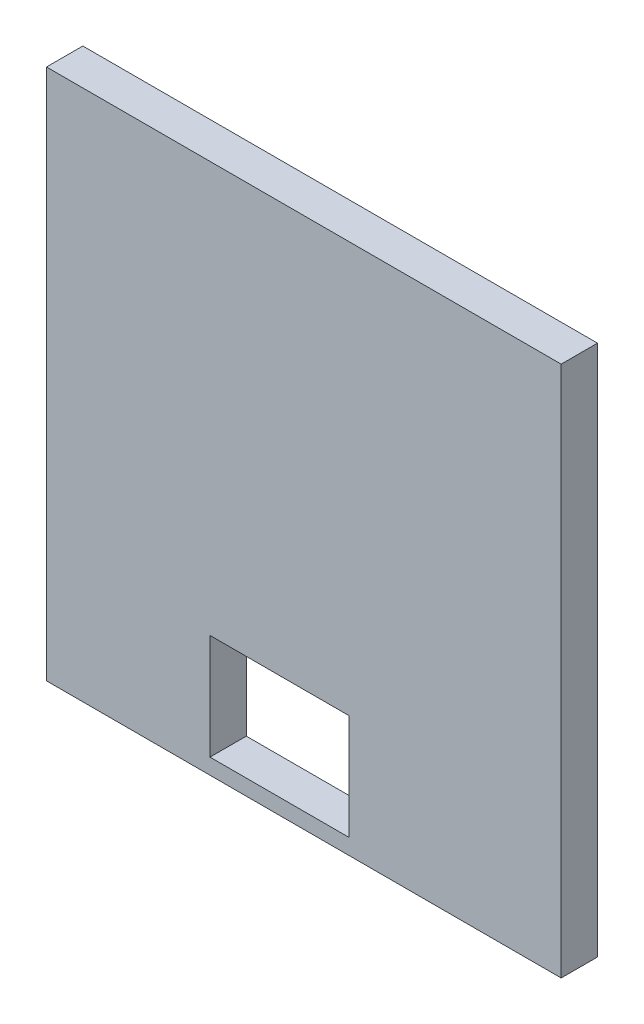
ISO-10303-21;
HEADER;
FILE_DESCRIPTION(('STEP AP214'),'2;1');
FILE_NAME('part.step','',(''),(''),'','','');
FILE_SCHEMA(('AUTOMOTIVE_DESIGN { 1 0 10303 214 1 1 1 1 }'));
ENDSEC;
DATA;
#1=APPLICATION_CONTEXT('core data for automotive mechanical design processes');
#2=APPLICATION_PROTOCOL_DEFINITION('international standard','automotive_design',2000,#1);
#3=PRODUCT_CONTEXT('',#1,'mechanical');
#4=PRODUCT('Part','Part','',(#3));
#5=PRODUCT_RELATED_PRODUCT_CATEGORY('part','',(#4));
#6=PRODUCT_DEFINITION_FORMATION('','',#4);
#7=PRODUCT_DEFINITION_CONTEXT('part definition',#1,'design');
#8=PRODUCT_DEFINITION('design','',#6,#7);
#9=PRODUCT_DEFINITION_SHAPE('','',#8);
#10=(LENGTH_UNIT() NAMED_UNIT(*) SI_UNIT(.MILLI.,.METRE.));
#11=(NAMED_UNIT(*) PLANE_ANGLE_UNIT() SI_UNIT($,.RADIAN.));
#12=(NAMED_UNIT(*) SI_UNIT($,.STERADIAN.) SOLID_ANGLE_UNIT());
#13=UNCERTAINTY_MEASURE_WITH_UNIT(LENGTH_MEASURE(1.E-05),#10,'distance_accuracy_value','');
#14=(GEOMETRIC_REPRESENTATION_CONTEXT(3) GLOBAL_UNCERTAINTY_ASSIGNED_CONTEXT((#13)) GLOBAL_UNIT_ASSIGNED_CONTEXT((#10,
#11,#12)) REPRESENTATION_CONTEXT('',''));
#15=CARTESIAN_POINT('',(0.,0.,0.));
#16=DIRECTION('',(0.,0.,1.));
#17=DIRECTION('',(1.,0.,0.));
#18=AXIS2_PLACEMENT_3D('',#15,#16,#17);
#19=CARTESIAN_POINT('',(21.25,43.9,64.25));
#20=DIRECTION('',(-1.,0.,0.));
#21=DIRECTION('',(0.,0.,1.));
#22=AXIS2_PLACEMENT_3D('',#19,#20,#21);
#23=PLANE('',#22);
#24=DIRECTION('',(0.,0.,-1.));
#25=VECTOR('',#24,1.);
#26=CARTESIAN_POINT('',(21.25,0.,64.25));
#27=LINE('',#26,#25);
#28=CARTESIAN_POINT('',(21.25,0.,64.25));
#29=VERTEX_POINT('',#28);
#30=CARTESIAN_POINT('',(21.25,0.,61.25));
#31=VERTEX_POINT('',#30);
#32=EDGE_CURVE('E219',#29,#31,#27,.T.);
#33=ORIENTED_EDGE('',*,*,#32,.T.);
#34=DIRECTION('',(0.,-1.,0.));
#35=VECTOR('',#34,1.);
#36=CARTESIAN_POINT('',(21.25,43.9,61.25));
#37=LINE('',#36,#35);
#38=CARTESIAN_POINT('',(21.25,43.9,61.25));
#39=VERTEX_POINT('',#38);
#40=EDGE_CURVE('E13',#39,#31,#37,.T.);
#41=ORIENTED_EDGE('',*,*,#40,.F.);
#42=DIRECTION('',(0.,0.,-1.));
#43=VECTOR('',#42,1.);
#44=CARTESIAN_POINT('',(21.25,43.9,64.25));
#45=LINE('',#44,#43);
#46=CARTESIAN_POINT('',(21.25,43.9,64.25));
#47=VERTEX_POINT('',#46);
#48=EDGE_CURVE('E224',#47,#39,#45,.T.);
#49=ORIENTED_EDGE('',*,*,#48,.F.);
#50=DIRECTION('',(0.,-1.,0.));
#51=VECTOR('',#50,1.);
#52=CARTESIAN_POINT('',(21.25,43.9,64.25));
#53=LINE('',#52,#51);
#54=EDGE_CURVE('E237',#47,#29,#53,.T.);
#55=ORIENTED_EDGE('',*,*,#54,.T.);
#56=EDGE_LOOP('',(#33,#41,#49,#55));
#57=FACE_BOUND('',#56,.T.);
#58=ADVANCED_FACE('F147',(#57),#23,.F.);
#59=CARTESIAN_POINT('',(-21.25,43.9,61.25));
#60=DIRECTION('',(0.,0.,1.));
#61=DIRECTION('',(1.,0.,0.));
#62=AXIS2_PLACEMENT_3D('',#59,#60,#61);
#63=PLANE('',#62);
#64=DIRECTION('',(1.,0.,0.));
#65=VECTOR('',#64,1.);
#66=CARTESIAN_POINT('',(-21.25,1.29578914383342,61.25));
#67=LINE('',#66,#65);
#68=CARTESIAN_POINT('',(-7.75,1.29578914383342,61.25));
#69=VERTEX_POINT('',#68);
#70=CARTESIAN_POINT('',(3.75,1.29578914383342,61.25));
#71=VERTEX_POINT('',#70);
#72=EDGE_CURVE('E256',#69,#71,#67,.T.);
#73=ORIENTED_EDGE('',*,*,#72,.T.);
#74=DIRECTION('',(0.,1.,0.));
#75=VECTOR('',#74,1.);
#76=CARTESIAN_POINT('',(3.75,43.9,61.25));
#77=LINE('',#76,#75);
#78=CARTESIAN_POINT('',(3.75,10.,61.25));
#79=VERTEX_POINT('',#78);
#80=EDGE_CURVE('E251',#71,#79,#77,.T.);
#81=ORIENTED_EDGE('',*,*,#80,.T.);
#82=DIRECTION('',(-1.,0.,0.));
#83=VECTOR('',#82,1.);
#84=CARTESIAN_POINT('',(-21.25,10.,61.25));
#85=LINE('',#84,#83);
#86=CARTESIAN_POINT('',(-7.75,10.,61.25));
#87=VERTEX_POINT('',#86);
#88=EDGE_CURVE('E380',#79,#87,#85,.T.);
#89=ORIENTED_EDGE('',*,*,#88,.T.);
#90=DIRECTION('',(0.,-1.,0.));
#91=VECTOR('',#90,1.);
#92=CARTESIAN_POINT('',(-7.75,43.9,61.25));
#93=LINE('',#92,#91);
#94=EDGE_CURVE('E261',#87,#69,#93,.T.);
#95=ORIENTED_EDGE('',*,*,#94,.T.);
#96=EDGE_LOOP('',(#73,#81,#89,#95));
#97=FACE_BOUND('',#96,.T.);
#98=DIRECTION('',(-1.,0.,0.));
#99=VECTOR('',#98,1.);
#100=CARTESIAN_POINT('',(-21.25,0.,61.25));
#101=LINE('',#100,#99);
#102=CARTESIAN_POINT('',(-21.25,0.,61.25));
#103=VERTEX_POINT('',#102);
#104=EDGE_CURVE('E233',#31,#103,#101,.T.);
#105=ORIENTED_EDGE('',*,*,#104,.T.);
#106=DIRECTION('',(0.,-1.,0.));
#107=VECTOR('',#106,1.);
#108=CARTESIAN_POINT('',(-21.25,43.9,61.25));
#109=LINE('',#108,#107);
#110=CARTESIAN_POINT('',(-21.25,43.9,61.25));
#111=VERTEX_POINT('',#110);
#112=EDGE_CURVE('E155',#111,#103,#109,.T.);
#113=ORIENTED_EDGE('',*,*,#112,.F.);
#114=DIRECTION('',(-1.,0.,0.));
#115=VECTOR('',#114,1.);
#116=CARTESIAN_POINT('',(-21.25,43.9,61.25));
#117=LINE('',#116,#115);
#118=EDGE_CURVE('E267',#39,#111,#117,.T.);
#119=ORIENTED_EDGE('',*,*,#118,.F.);
#120=ORIENTED_EDGE('',*,*,#40,.T.);
#121=EDGE_LOOP('',(#105,#113,#119,#120));
#122=FACE_BOUND('',#121,.T.);
#123=ADVANCED_FACE('F274',(#97,#122),#63,.F.);
#124=CARTESIAN_POINT('',(-21.25,43.9,64.25));
#125=DIRECTION('',(1.,0.,0.));
#126=DIRECTION('',(0.,0.,-1.));
#127=AXIS2_PLACEMENT_3D('',#124,#125,#126);
#128=PLANE('',#127);
#129=DIRECTION('',(0.,0.,1.));
#130=VECTOR('',#129,1.);
#131=CARTESIAN_POINT('',(-21.25,0.,64.25));
#132=LINE('',#131,#130);
#133=CARTESIAN_POINT('',(-21.25,0.,64.25));
#134=VERTEX_POINT('',#133);
#135=EDGE_CURVE('E216',#103,#134,#132,.T.);
#136=ORIENTED_EDGE('',*,*,#135,.T.);
#137=DIRECTION('',(0.,-1.,0.));
#138=VECTOR('',#137,1.);
#139=CARTESIAN_POINT('',(-21.25,43.9,64.25));
#140=LINE('',#139,#138);
#141=CARTESIAN_POINT('',(-21.25,43.9,64.25));
#142=VERTEX_POINT('',#141);
#143=EDGE_CURVE('E230',#142,#134,#140,.T.);
#144=ORIENTED_EDGE('',*,*,#143,.F.);
#145=DIRECTION('',(0.,0.,1.));
#146=VECTOR('',#145,1.);
#147=CARTESIAN_POINT('',(-21.25,43.9,64.25));
#148=LINE('',#147,#146);
#149=EDGE_CURVE('E269',#111,#142,#148,.T.);
#150=ORIENTED_EDGE('',*,*,#149,.F.);
#151=ORIENTED_EDGE('',*,*,#112,.T.);
#152=EDGE_LOOP('',(#136,#144,#150,#151));
#153=FACE_BOUND('',#152,.T.);
#154=ADVANCED_FACE('F228',(#153),#128,.F.);
#155=CARTESIAN_POINT('',(-21.25,43.9,64.25));
#156=DIRECTION('',(0.,0.,-1.));
#157=DIRECTION('',(-1.,0.,0.));
#158=AXIS2_PLACEMENT_3D('',#155,#156,#157);
#159=PLANE('',#158);
#160=DIRECTION('',(-1.,0.,0.));
#161=VECTOR('',#160,1.);
#162=CARTESIAN_POINT('',(-7.75,10.,64.25));
#163=LINE('',#162,#161);
#164=CARTESIAN_POINT('',(3.75,10.,64.25));
#165=VERTEX_POINT('',#164);
#166=CARTESIAN_POINT('',(-7.75,10.,64.25));
#167=VERTEX_POINT('',#166);
#168=EDGE_CURVE('E373',#165,#167,#163,.T.);
#169=ORIENTED_EDGE('',*,*,#168,.F.);
#170=DIRECTION('',(0.,1.,0.));
#171=VECTOR('',#170,1.);
#172=CARTESIAN_POINT('',(3.75,1.29578914383342,64.25));
#173=LINE('',#172,#171);
#174=CARTESIAN_POINT('',(3.75,1.29578914383342,64.25));
#175=VERTEX_POINT('',#174);
#176=EDGE_CURVE('E171',#175,#165,#173,.T.);
#177=ORIENTED_EDGE('',*,*,#176,.F.);
#178=DIRECTION('',(1.,0.,0.));
#179=VECTOR('',#178,1.);
#180=CARTESIAN_POINT('',(-7.75,1.29578914383342,64.25));
#181=LINE('',#180,#179);
#182=CARTESIAN_POINT('',(-7.75,1.29578914383342,64.25));
#183=VERTEX_POINT('',#182);
#184=EDGE_CURVE('E366',#183,#175,#181,.T.);
#185=ORIENTED_EDGE('',*,*,#184,.F.);
#186=DIRECTION('',(0.,-1.,0.));
#187=VECTOR('',#186,1.);
#188=CARTESIAN_POINT('',(-7.75,1.29578914383342,64.25));
#189=LINE('',#188,#187);
#190=EDGE_CURVE('E371',#167,#183,#189,.T.);
#191=ORIENTED_EDGE('',*,*,#190,.F.);
#192=EDGE_LOOP('',(#169,#177,#185,#191));
#193=FACE_BOUND('',#192,.T.);
#194=DIRECTION('',(1.,0.,0.));
#195=VECTOR('',#194,1.);
#196=CARTESIAN_POINT('',(-21.25,0.,64.25));
#197=LINE('',#196,#195);
#198=EDGE_CURVE('E213',#134,#29,#197,.T.);
#199=ORIENTED_EDGE('',*,*,#198,.T.);
#200=ORIENTED_EDGE('',*,*,#54,.F.);
#201=DIRECTION('',(1.,0.,0.));
#202=VECTOR('',#201,1.);
#203=CARTESIAN_POINT('',(-21.25,43.9,64.25));
#204=LINE('',#203,#202);
#205=EDGE_CURVE('E236',#142,#47,#204,.T.);
#206=ORIENTED_EDGE('',*,*,#205,.F.);
#207=ORIENTED_EDGE('',*,*,#143,.T.);
#208=EDGE_LOOP('',(#199,#200,#206,#207));
#209=FACE_BOUND('',#208,.T.);
#210=ADVANCED_FACE('F235',(#193,#209),#159,.F.);
#211=CARTESIAN_POINT('',(0.,43.9,0.));
#212=DIRECTION('',(0.,-1.,0.));
#213=DIRECTION('',(0.,0.,-1.));
#214=AXIS2_PLACEMENT_3D('',#211,#212,#213);
#215=PLANE('',#214);
#216=ORIENTED_EDGE('',*,*,#48,.T.);
#217=ORIENTED_EDGE('',*,*,#118,.T.);
#218=ORIENTED_EDGE('',*,*,#149,.T.);
#219=ORIENTED_EDGE('',*,*,#205,.T.);
#220=EDGE_LOOP('',(#216,#217,#218,#219));
#221=FACE_BOUND('',#220,.T.);
#222=ADVANCED_FACE('F271',(#221),#215,.F.);
#223=CARTESIAN_POINT('',(3.75,1.29578914383342,18.75));
#224=DIRECTION('',(1.,0.,0.));
#225=DIRECTION('',(0.,0.,-1.));
#226=AXIS2_PLACEMENT_3D('',#223,#224,#225);
#227=PLANE('',#226);
#228=DIRECTION('',(0.,0.,1.));
#229=VECTOR('',#228,1.);
#230=CARTESIAN_POINT('',(3.75,1.29578914383342,18.75));
#231=LINE('',#230,#229);
#232=EDGE_CURVE('E368',#71,#175,#231,.T.);
#233=ORIENTED_EDGE('',*,*,#232,.T.);
#234=ORIENTED_EDGE('',*,*,#176,.T.);
#235=DIRECTION('',(0.,0.,1.));
#236=VECTOR('',#235,1.);
#237=CARTESIAN_POINT('',(3.75,10.,18.75));
#238=LINE('',#237,#236);
#239=EDGE_CURVE('E375',#79,#165,#238,.T.);
#240=ORIENTED_EDGE('',*,*,#239,.F.);
#241=ORIENTED_EDGE('',*,*,#80,.F.);
#242=EDGE_LOOP('',(#233,#234,#240,#241));
#243=FACE_BOUND('',#242,.T.);
#244=ADVANCED_FACE('F287',(#243),#227,.F.);
#245=CARTESIAN_POINT('',(-7.75,1.29578914383342,18.75));
#246=DIRECTION('',(0.,-1.,0.));
#247=DIRECTION('',(0.,0.,-1.));
#248=AXIS2_PLACEMENT_3D('',#245,#246,#247);
#249=PLANE('',#248);
#250=DIRECTION('',(0.,0.,1.));
#251=VECTOR('',#250,1.);
#252=CARTESIAN_POINT('',(-7.75,1.29578914383342,18.75));
#253=LINE('',#252,#251);
#254=EDGE_CURVE('E362',#69,#183,#253,.T.);
#255=ORIENTED_EDGE('',*,*,#254,.T.);
#256=ORIENTED_EDGE('',*,*,#184,.T.);
#257=ORIENTED_EDGE('',*,*,#232,.F.);
#258=ORIENTED_EDGE('',*,*,#72,.F.);
#259=EDGE_LOOP('',(#255,#256,#257,#258));
#260=FACE_BOUND('',#259,.T.);
#261=ADVANCED_FACE('F290',(#260),#249,.F.);
#262=CARTESIAN_POINT('',(-7.75,1.29578914383342,18.75));
#263=DIRECTION('',(-1.,0.,0.));
#264=DIRECTION('',(0.,0.,1.));
#265=AXIS2_PLACEMENT_3D('',#262,#263,#264);
#266=PLANE('',#265);
#267=DIRECTION('',(0.,0.,1.));
#268=VECTOR('',#267,1.);
#269=CARTESIAN_POINT('',(-7.75,10.,18.75));
#270=LINE('',#269,#268);
#271=EDGE_CURVE('E163',#87,#167,#270,.T.);
#272=ORIENTED_EDGE('',*,*,#271,.T.);
#273=ORIENTED_EDGE('',*,*,#190,.T.);
#274=ORIENTED_EDGE('',*,*,#254,.F.);
#275=ORIENTED_EDGE('',*,*,#94,.F.);
#276=EDGE_LOOP('',(#272,#273,#274,#275));
#277=FACE_BOUND('',#276,.T.);
#278=ADVANCED_FACE('F294',(#277),#266,.F.);
#279=CARTESIAN_POINT('',(-7.75,10.,18.75));
#280=DIRECTION('',(0.,1.,0.));
#281=DIRECTION('',(0.,0.,1.));
#282=AXIS2_PLACEMENT_3D('',#279,#280,#281);
#283=PLANE('',#282);
#284=ORIENTED_EDGE('',*,*,#239,.T.);
#285=ORIENTED_EDGE('',*,*,#168,.T.);
#286=ORIENTED_EDGE('',*,*,#271,.F.);
#287=ORIENTED_EDGE('',*,*,#88,.F.);
#288=EDGE_LOOP('',(#284,#285,#286,#287));
#289=FACE_BOUND('',#288,.T.);
#290=ADVANCED_FACE('F291',(#289),#283,.F.);
#291=CARTESIAN_POINT('',(0.,0.,0.));
#292=DIRECTION('',(0.,1.,0.));
#293=DIRECTION('',(0.,0.,1.));
#294=AXIS2_PLACEMENT_3D('',#291,#292,#293);
#295=PLANE('',#294);
#296=ORIENTED_EDGE('',*,*,#198,.F.);
#297=ORIENTED_EDGE('',*,*,#135,.F.);
#298=ORIENTED_EDGE('',*,*,#104,.F.);
#299=ORIENTED_EDGE('',*,*,#32,.F.);
#300=EDGE_LOOP('',(#296,#297,#298,#299));
#301=FACE_BOUND('',#300,.T.);
#302=ADVANCED_FACE('F215',(#301),#295,.F.);
#303=CLOSED_SHELL('',(#58,#123,#154,#210,#222,#244,#261,#278,#290,#302));
#304=MANIFOLD_SOLID_BREP('B2',#303);
#305=ADVANCED_BREP_SHAPE_REPRESENTATION('',(#18,#304),#14);
#306=SHAPE_DEFINITION_REPRESENTATION(#9,#305);
ENDSEC;
END-ISO-10303-21;
